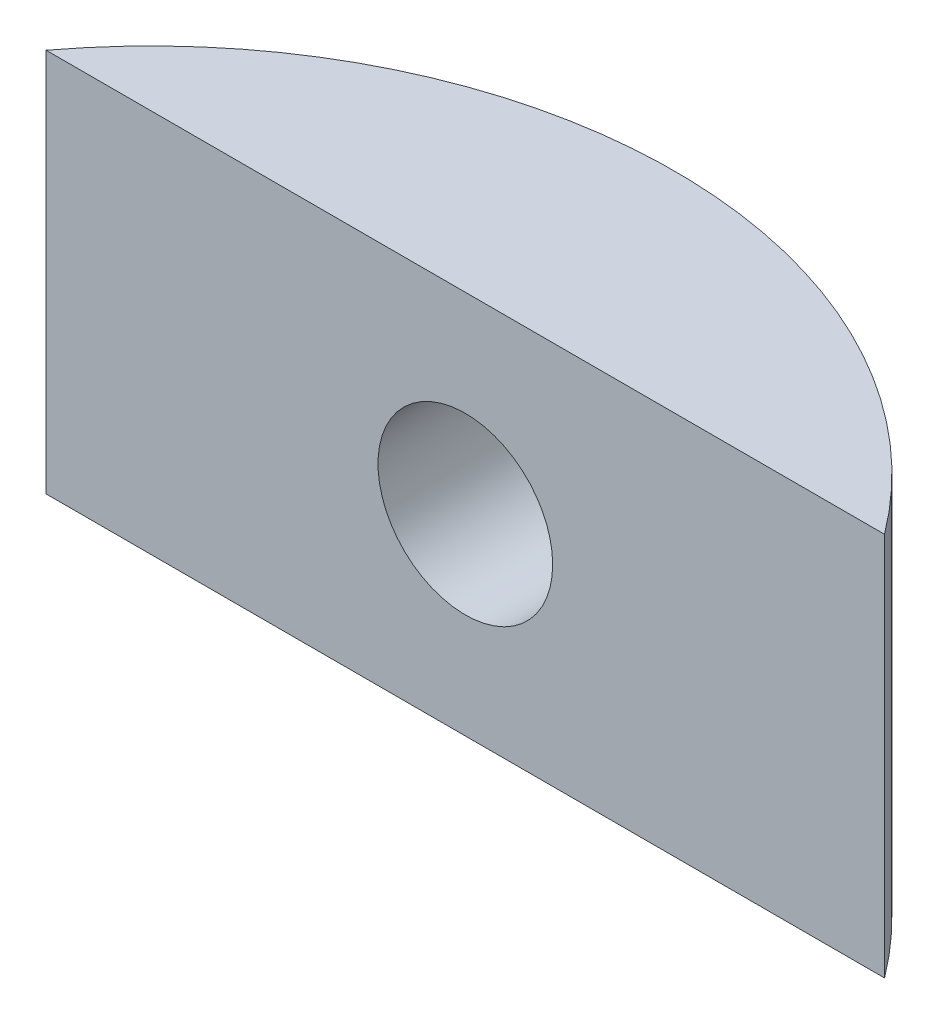
ISO-10303-21;
HEADER;
FILE_DESCRIPTION(('STEP AP214'),'2;1');
FILE_NAME('part.step','',(''),(''),'','','');
FILE_SCHEMA(('AUTOMOTIVE_DESIGN { 1 0 10303 214 1 1 1 1 }'));
ENDSEC;
DATA;
#1=APPLICATION_CONTEXT('core data for automotive mechanical design processes');
#2=APPLICATION_PROTOCOL_DEFINITION('international standard','automotive_design',2000,#1);
#3=PRODUCT_CONTEXT('',#1,'mechanical');
#4=PRODUCT('Part','Part','',(#3));
#5=PRODUCT_RELATED_PRODUCT_CATEGORY('part','',(#4));
#6=PRODUCT_DEFINITION_FORMATION('','',#4);
#7=PRODUCT_DEFINITION_CONTEXT('part definition',#1,'design');
#8=PRODUCT_DEFINITION('design','',#6,#7);
#9=PRODUCT_DEFINITION_SHAPE('','',#8);
#10=(LENGTH_UNIT() NAMED_UNIT(*) SI_UNIT(.MILLI.,.METRE.));
#11=(NAMED_UNIT(*) PLANE_ANGLE_UNIT() SI_UNIT($,.RADIAN.));
#12=(NAMED_UNIT(*) SI_UNIT($,.STERADIAN.) SOLID_ANGLE_UNIT());
#13=UNCERTAINTY_MEASURE_WITH_UNIT(LENGTH_MEASURE(1.E-05),#10,'distance_accuracy_value','');
#14=(GEOMETRIC_REPRESENTATION_CONTEXT(3) GLOBAL_UNCERTAINTY_ASSIGNED_CONTEXT((#13)) GLOBAL_UNIT_ASSIGNED_CONTEXT((#10,
#11,#12)) REPRESENTATION_CONTEXT('',''));
#15=CARTESIAN_POINT('',(0.,0.,0.));
#16=DIRECTION('',(0.,0.,1.));
#17=DIRECTION('',(1.,0.,0.));
#18=AXIS2_PLACEMENT_3D('',#15,#16,#17);
#19=CARTESIAN_POINT('',(0.,11.,-9.));
#20=DIRECTION('',(0.,0.,-1.));
#21=DIRECTION('',(-1.,0.,0.));
#22=AXIS2_PLACEMENT_3D('',#19,#20,#21);
#23=PLANE('',#22);
#24=CARTESIAN_POINT('',(0.,5.5,-9.));
#25=DIRECTION('',(0.,0.,1.));
#26=DIRECTION('',(1.,0.,0.));
#27=AXIS2_PLACEMENT_3D('',#24,#25,#26);
#28=CIRCLE('',#27,2.5);
#29=CARTESIAN_POINT('',(2.5,5.5,-9.));
#30=VERTEX_POINT('',#29);
#31=EDGE_CURVE('E90',#30,#30,#28,.T.);
#32=ORIENTED_EDGE('',*,*,#31,.F.);
#33=EDGE_LOOP('',(#32));
#34=FACE_BOUND('',#33,.T.);
#35=DIRECTION('',(1.,0.,0.));
#36=VECTOR('',#35,1.);
#37=CARTESIAN_POINT('',(0.,0.,-9.));
#38=LINE('',#37,#36);
#39=CARTESIAN_POINT('',(-12.,0.,-9.));
#40=VERTEX_POINT('',#39);
#41=CARTESIAN_POINT('',(12.,0.,-9.));
#42=VERTEX_POINT('',#41);
#43=EDGE_CURVE('E80',#40,#42,#38,.T.);
#44=ORIENTED_EDGE('',*,*,#43,.T.);
#45=DIRECTION('',(0.,-1.,0.));
#46=VECTOR('',#45,1.);
#47=CARTESIAN_POINT('',(12.,11.,-9.));
#48=LINE('',#47,#46);
#49=CARTESIAN_POINT('',(12.,11.,-9.));
#50=VERTEX_POINT('',#49);
#51=EDGE_CURVE('E11',#50,#42,#48,.T.);
#52=ORIENTED_EDGE('',*,*,#51,.F.);
#53=DIRECTION('',(1.,0.,0.));
#54=VECTOR('',#53,1.);
#55=CARTESIAN_POINT('',(0.,11.,-9.));
#56=LINE('',#55,#54);
#57=CARTESIAN_POINT('',(-12.,11.,-9.));
#58=VERTEX_POINT('',#57);
#59=EDGE_CURVE('E79',#58,#50,#56,.T.);
#60=ORIENTED_EDGE('',*,*,#59,.F.);
#61=DIRECTION('',(0.,-1.,0.));
#62=VECTOR('',#61,1.);
#63=CARTESIAN_POINT('',(-12.,11.,-9.));
#64=LINE('',#63,#62);
#65=EDGE_CURVE('E56',#58,#40,#64,.T.);
#66=ORIENTED_EDGE('',*,*,#65,.T.);
#67=EDGE_LOOP('',(#44,#52,#60,#66));
#68=FACE_BOUND('',#67,.T.);
#69=ADVANCED_FACE('F47',(#34,#68),#23,.F.);
#70=CARTESIAN_POINT('',(0.,11.,0.));
#71=DIRECTION('',(0.,-1.,0.));
#72=DIRECTION('',(0.,0.,-1.));
#73=AXIS2_PLACEMENT_3D('',#70,#71,#72);
#74=CYLINDRICAL_SURFACE('',#73,15.);
#75=CARTESIAN_POINT('',(0.,0.,0.));
#76=DIRECTION('',(0.,1.,0.));
#77=DIRECTION('',(0.,0.,1.));
#78=AXIS2_PLACEMENT_3D('',#75,#76,#77);
#79=CIRCLE('',#78,15.);
#80=EDGE_CURVE('E71',#42,#40,#79,.T.);
#81=ORIENTED_EDGE('',*,*,#80,.T.);
#82=ORIENTED_EDGE('',*,*,#65,.F.);
#83=CARTESIAN_POINT('',(0.,11.,0.));
#84=DIRECTION('',(0.,1.,0.));
#85=DIRECTION('',(0.,0.,1.));
#86=AXIS2_PLACEMENT_3D('',#83,#84,#85);
#87=CIRCLE('',#86,15.);
#88=EDGE_CURVE('E63',#50,#58,#87,.T.);
#89=ORIENTED_EDGE('',*,*,#88,.F.);
#90=ORIENTED_EDGE('',*,*,#51,.T.);
#91=EDGE_LOOP('',(#81,#82,#89,#90));
#92=FACE_BOUND('',#91,.T.);
#93=ADVANCED_FACE('F74',(#92),#74,.T.);
#94=CARTESIAN_POINT('',(0.,11.,0.));
#95=DIRECTION('',(0.,1.,0.));
#96=DIRECTION('',(0.,0.,1.));
#97=AXIS2_PLACEMENT_3D('',#94,#95,#96);
#98=PLANE('',#97);
#99=ORIENTED_EDGE('',*,*,#59,.T.);
#100=ORIENTED_EDGE('',*,*,#88,.T.);
#101=EDGE_LOOP('',(#99,#100));
#102=FACE_BOUND('',#101,.T.);
#103=ADVANCED_FACE('F109',(#102),#98,.T.);
#104=CARTESIAN_POINT('',(0.,0.,0.));
#105=DIRECTION('',(0.,1.,0.));
#106=DIRECTION('',(0.,0.,1.));
#107=AXIS2_PLACEMENT_3D('',#104,#105,#106);
#108=PLANE('',#107);
#109=ORIENTED_EDGE('',*,*,#43,.F.);
#110=ORIENTED_EDGE('',*,*,#80,.F.);
#111=EDGE_LOOP('',(#109,#110));
#112=FACE_BOUND('',#111,.T.);
#113=ADVANCED_FACE('F84',(#112),#108,.F.);
#114=CARTESIAN_POINT('',(0.,5.5,-14.));
#115=DIRECTION('',(0.,0.,1.));
#116=DIRECTION('',(1.,0.,0.));
#117=AXIS2_PLACEMENT_3D('',#114,#115,#116);
#118=CYLINDRICAL_SURFACE('',#117,2.5);
#119=CARTESIAN_POINT('',(0.,5.5,-14.));
#120=DIRECTION('',(0.,0.,1.));
#121=DIRECTION('',(1.,0.,0.));
#122=AXIS2_PLACEMENT_3D('',#119,#120,#121);
#123=CIRCLE('',#122,2.5);
#124=CARTESIAN_POINT('',(2.5,5.5,-14.));
#125=VERTEX_POINT('',#124);
#126=EDGE_CURVE('E86',#125,#125,#123,.T.);
#127=ORIENTED_EDGE('',*,*,#126,.F.);
#128=EDGE_LOOP('',(#127));
#129=FACE_BOUND('',#128,.T.);
#130=ORIENTED_EDGE('',*,*,#31,.T.);
#131=EDGE_LOOP('',(#130));
#132=FACE_BOUND('',#131,.T.);
#133=ADVANCED_FACE('F101',(#129,#132),#118,.F.);
#134=CARTESIAN_POINT('',(0.,0.,-14.));
#135=DIRECTION('',(0.,0.,1.));
#136=DIRECTION('',(1.,0.,0.));
#137=AXIS2_PLACEMENT_3D('',#134,#135,#136);
#138=PLANE('',#137);
#139=ORIENTED_EDGE('',*,*,#126,.T.);
#140=EDGE_LOOP('',(#139));
#141=FACE_BOUND('',#140,.T.);
#142=ADVANCED_FACE('F117',(#141),#138,.T.);
#143=CLOSED_SHELL('',(#69,#93,#103,#113,#133,#142));
#144=MANIFOLD_SOLID_BREP('B2',#143);
#145=ADVANCED_BREP_SHAPE_REPRESENTATION('',(#18,#144),#14);
#146=SHAPE_DEFINITION_REPRESENTATION(#9,#145);
ENDSEC;
END-ISO-10303-21;
